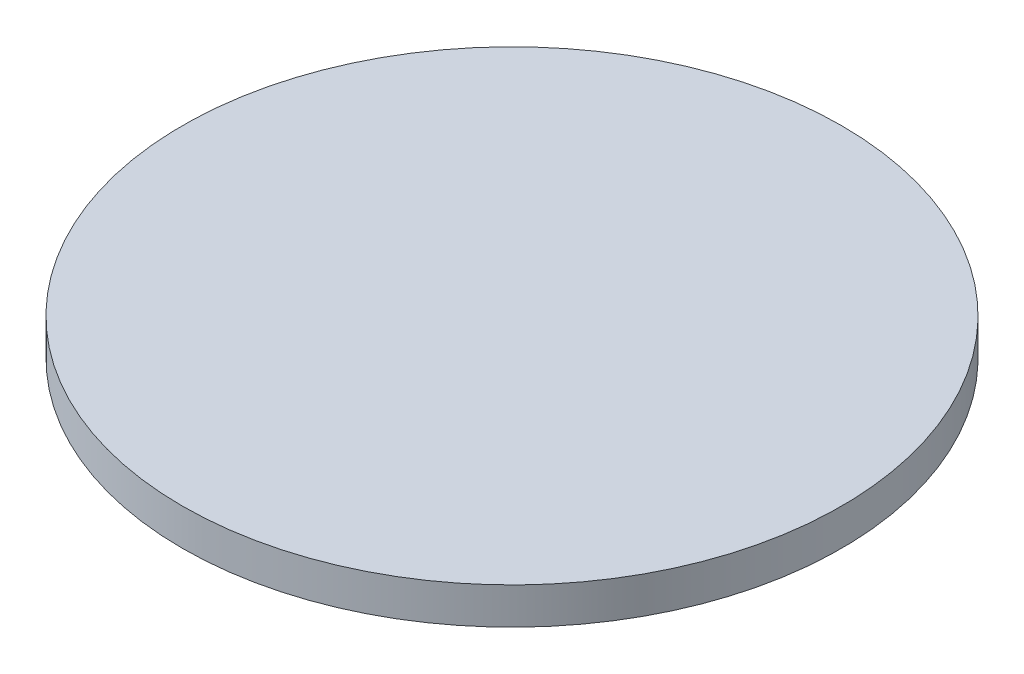
ISO-10303-21;
HEADER;
FILE_DESCRIPTION(('STEP AP214'),'2;1');
FILE_NAME('part.step','',(''),(''),'','','');
FILE_SCHEMA(('AUTOMOTIVE_DESIGN { 1 0 10303 214 1 1 1 1 }'));
ENDSEC;
DATA;
#1=APPLICATION_CONTEXT('core data for automotive mechanical design processes');
#2=APPLICATION_PROTOCOL_DEFINITION('international standard','automotive_design',2000,#1);
#3=PRODUCT_CONTEXT('',#1,'mechanical');
#4=PRODUCT('Part','Part','',(#3));
#5=PRODUCT_RELATED_PRODUCT_CATEGORY('part','',(#4));
#6=PRODUCT_DEFINITION_FORMATION('','',#4);
#7=PRODUCT_DEFINITION_CONTEXT('part definition',#1,'design');
#8=PRODUCT_DEFINITION('design','',#6,#7);
#9=PRODUCT_DEFINITION_SHAPE('','',#8);
#10=(LENGTH_UNIT() NAMED_UNIT(*) SI_UNIT(.MILLI.,.METRE.));
#11=(NAMED_UNIT(*) PLANE_ANGLE_UNIT() SI_UNIT($,.RADIAN.));
#12=(NAMED_UNIT(*) SI_UNIT($,.STERADIAN.) SOLID_ANGLE_UNIT());
#13=UNCERTAINTY_MEASURE_WITH_UNIT(LENGTH_MEASURE(1.E-05),#10,'distance_accuracy_value','');
#14=(GEOMETRIC_REPRESENTATION_CONTEXT(3) GLOBAL_UNCERTAINTY_ASSIGNED_CONTEXT((#13)) GLOBAL_UNIT_ASSIGNED_CONTEXT((#10,
#11,#12)) REPRESENTATION_CONTEXT('',''));
#15=CARTESIAN_POINT('',(0.,0.,0.));
#16=DIRECTION('',(0.,0.,1.));
#17=DIRECTION('',(1.,0.,0.));
#18=AXIS2_PLACEMENT_3D('',#15,#16,#17);
#19=CARTESIAN_POINT('',(0.,10.,0.));
#20=DIRECTION('',(0.,-1.,0.));
#21=DIRECTION('',(0.,0.,-1.));
#22=AXIS2_PLACEMENT_3D('',#19,#20,#21);
#23=CYLINDRICAL_SURFACE('',#22,90.);
#24=CARTESIAN_POINT('',(0.,10.,0.));
#25=DIRECTION('',(0.,1.,0.));
#26=DIRECTION('',(0.,0.,1.));
#27=AXIS2_PLACEMENT_3D('',#24,#25,#26);
#28=CIRCLE('',#27,90.);
#29=CARTESIAN_POINT('',(0.,10.,90.));
#30=VERTEX_POINT('',#29);
#31=EDGE_CURVE('E10',#30,#30,#28,.T.);
#32=ORIENTED_EDGE('',*,*,#31,.F.);
#33=EDGE_LOOP('',(#32));
#34=FACE_BOUND('',#33,.T.);
#35=CARTESIAN_POINT('',(0.,0.,0.));
#36=DIRECTION('',(0.,1.,0.));
#37=DIRECTION('',(0.,0.,1.));
#38=AXIS2_PLACEMENT_3D('',#35,#36,#37);
#39=CIRCLE('',#38,90.);
#40=CARTESIAN_POINT('',(0.,0.,90.));
#41=VERTEX_POINT('',#40);
#42=EDGE_CURVE('E34',#41,#41,#39,.T.);
#43=ORIENTED_EDGE('',*,*,#42,.T.);
#44=EDGE_LOOP('',(#43));
#45=FACE_BOUND('',#44,.T.);
#46=ADVANCED_FACE('F31',(#34,#45),#23,.T.);
#47=CARTESIAN_POINT('',(0.,10.,0.));
#48=DIRECTION('',(0.,1.,0.));
#49=DIRECTION('',(0.,0.,1.));
#50=AXIS2_PLACEMENT_3D('',#47,#48,#49);
#51=PLANE('',#50);
#52=ORIENTED_EDGE('',*,*,#31,.T.);
#53=EDGE_LOOP('',(#52));
#54=FACE_BOUND('',#53,.T.);
#55=ADVANCED_FACE('F46',(#54),#51,.T.);
#56=CARTESIAN_POINT('',(0.,0.,0.));
#57=DIRECTION('',(0.,1.,0.));
#58=DIRECTION('',(0.,0.,1.));
#59=AXIS2_PLACEMENT_3D('',#56,#57,#58);
#60=PLANE('',#59);
#61=ORIENTED_EDGE('',*,*,#42,.F.);
#62=EDGE_LOOP('',(#61));
#63=FACE_BOUND('',#62,.T.);
#64=ADVANCED_FACE('F44',(#63),#60,.F.);
#65=CLOSED_SHELL('',(#46,#55,#64));
#66=MANIFOLD_SOLID_BREP('B2',#65);
#67=ADVANCED_BREP_SHAPE_REPRESENTATION('',(#18,#66),#14);
#68=SHAPE_DEFINITION_REPRESENTATION(#9,#67);
ENDSEC;
END-ISO-10303-21;
